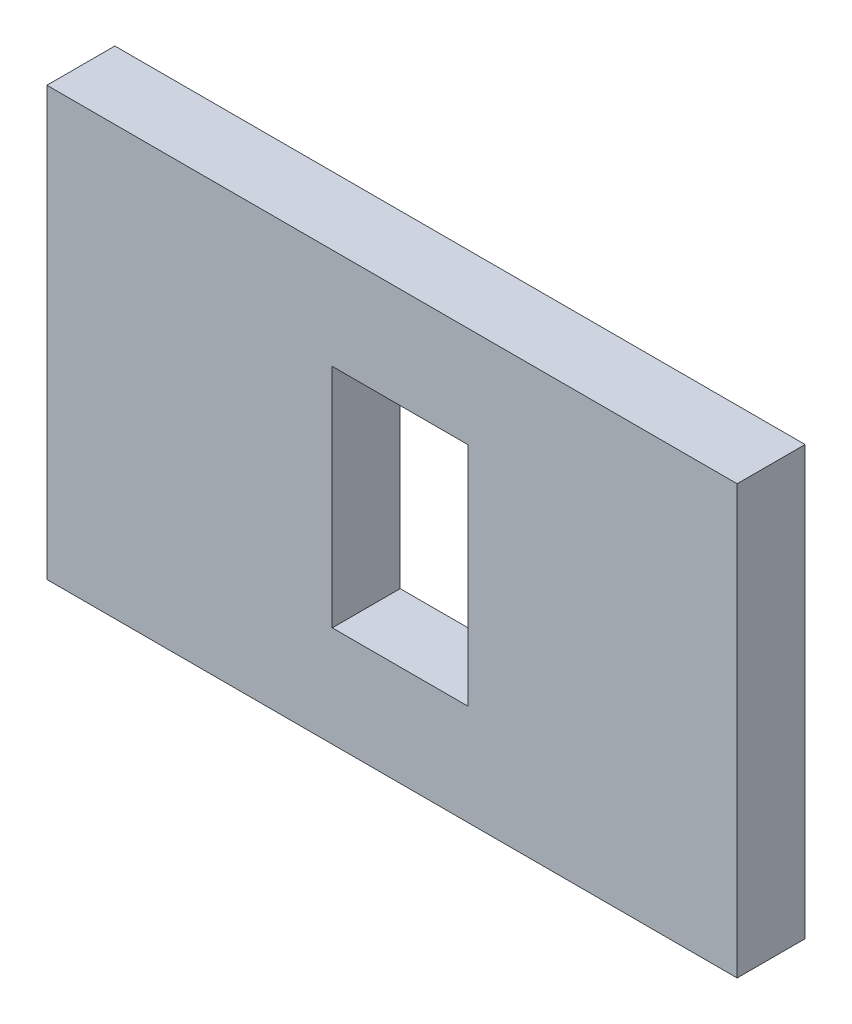
ISO-10303-21;
HEADER;
FILE_DESCRIPTION(('STEP AP214'),'2;1');
FILE_NAME('part.step','',(''),(''),'','','');
FILE_SCHEMA(('AUTOMOTIVE_DESIGN { 1 0 10303 214 1 1 1 1 }'));
ENDSEC;
DATA;
#1=APPLICATION_CONTEXT('core data for automotive mechanical design processes');
#2=APPLICATION_PROTOCOL_DEFINITION('international standard','automotive_design',2000,#1);
#3=PRODUCT_CONTEXT('',#1,'mechanical');
#4=PRODUCT('Part','Part','',(#3));
#5=PRODUCT_RELATED_PRODUCT_CATEGORY('part','',(#4));
#6=PRODUCT_DEFINITION_FORMATION('','',#4);
#7=PRODUCT_DEFINITION_CONTEXT('part definition',#1,'design');
#8=PRODUCT_DEFINITION('design','',#6,#7);
#9=PRODUCT_DEFINITION_SHAPE('','',#8);
#10=(LENGTH_UNIT() NAMED_UNIT(*) SI_UNIT(.MILLI.,.METRE.));
#11=(NAMED_UNIT(*) PLANE_ANGLE_UNIT() SI_UNIT($,.RADIAN.));
#12=(NAMED_UNIT(*) SI_UNIT($,.STERADIAN.) SOLID_ANGLE_UNIT());
#13=UNCERTAINTY_MEASURE_WITH_UNIT(LENGTH_MEASURE(1.E-05),#10,'distance_accuracy_value','');
#14=(GEOMETRIC_REPRESENTATION_CONTEXT(3) GLOBAL_UNCERTAINTY_ASSIGNED_CONTEXT((#13)) GLOBAL_UNIT_ASSIGNED_CONTEXT((#10,
#11,#12)) REPRESENTATION_CONTEXT('',''));
#15=CARTESIAN_POINT('',(0.,0.,0.));
#16=DIRECTION('',(0.,0.,1.));
#17=DIRECTION('',(1.,0.,0.));
#18=AXIS2_PLACEMENT_3D('',#15,#16,#17);
#19=CARTESIAN_POINT('',(0.,0.,6.));
#20=DIRECTION('',(0.,0.,1.));
#21=DIRECTION('',(1.,0.,0.));
#22=AXIS2_PLACEMENT_3D('',#19,#20,#21);
#23=PLANE('',#22);
#24=DIRECTION('',(0.,-1.,0.));
#25=VECTOR('',#24,1.);
#26=CARTESIAN_POINT('',(63.8023878554711,37.8,6.));
#27=LINE('',#26,#25);
#28=CARTESIAN_POINT('',(63.8023878554711,37.8,6.));
#29=VERTEX_POINT('',#28);
#30=CARTESIAN_POINT('',(63.8023878554711,0.,6.));
#31=VERTEX_POINT('',#30);
#32=EDGE_CURVE('E157',#29,#31,#27,.T.);
#33=ORIENTED_EDGE('',*,*,#32,.T.);
#34=DIRECTION('',(1.,0.,0.));
#35=VECTOR('',#34,1.);
#36=CARTESIAN_POINT('',(63.8023878554711,0.,6.));
#37=LINE('',#36,#35);
#38=CARTESIAN_POINT('',(124.755899643762,0.,6.));
#39=VERTEX_POINT('',#38);
#40=EDGE_CURVE('E161',#31,#39,#37,.T.);
#41=ORIENTED_EDGE('',*,*,#40,.T.);
#42=DIRECTION('',(0.,1.,0.));
#43=VECTOR('',#42,1.);
#44=CARTESIAN_POINT('',(124.755899643762,37.8,6.));
#45=LINE('',#44,#43);
#46=CARTESIAN_POINT('',(124.755899643762,37.8,6.));
#47=VERTEX_POINT('',#46);
#48=EDGE_CURVE('E165',#39,#47,#45,.T.);
#49=ORIENTED_EDGE('',*,*,#48,.T.);
#50=DIRECTION('',(-1.,0.,0.));
#51=VECTOR('',#50,1.);
#52=CARTESIAN_POINT('',(63.8023878554711,37.8,6.));
#53=LINE('',#52,#51);
#54=EDGE_CURVE('E168',#47,#29,#53,.T.);
#55=ORIENTED_EDGE('',*,*,#54,.T.);
#56=EDGE_LOOP('',(#33,#41,#49,#55));
#57=FACE_BOUND('',#56,.T.);
#58=DIRECTION('',(1.,0.,0.));
#59=VECTOR('',#58,1.);
#60=CARTESIAN_POINT('',(89.,8.9,6.));
#61=LINE('',#60,#59);
#62=CARTESIAN_POINT('',(89.,8.9,6.));
#63=VERTEX_POINT('',#62);
#64=CARTESIAN_POINT('',(101.,8.9,6.));
#65=VERTEX_POINT('',#64);
#66=EDGE_CURVE('E118',#63,#65,#61,.T.);
#67=ORIENTED_EDGE('',*,*,#66,.F.);
#68=DIRECTION('',(0.,-1.,0.));
#69=VECTOR('',#68,1.);
#70=CARTESIAN_POINT('',(89.,28.9,6.));
#71=LINE('',#70,#69);
#72=CARTESIAN_POINT('',(89.,28.9,6.));
#73=VERTEX_POINT('',#72);
#74=EDGE_CURVE('E109',#73,#63,#71,.T.);
#75=ORIENTED_EDGE('',*,*,#74,.F.);
#76=DIRECTION('',(-1.,0.,0.));
#77=VECTOR('',#76,1.);
#78=CARTESIAN_POINT('',(89.,28.9,6.));
#79=LINE('',#78,#77);
#80=CARTESIAN_POINT('',(101.,28.9,6.));
#81=VERTEX_POINT('',#80);
#82=EDGE_CURVE('E135',#81,#73,#79,.T.);
#83=ORIENTED_EDGE('',*,*,#82,.F.);
#84=DIRECTION('',(0.,1.,0.));
#85=VECTOR('',#84,1.);
#86=CARTESIAN_POINT('',(101.,28.9,6.));
#87=LINE('',#86,#85);
#88=EDGE_CURVE('E131',#65,#81,#87,.T.);
#89=ORIENTED_EDGE('',*,*,#88,.F.);
#90=EDGE_LOOP('',(#67,#75,#83,#89));
#91=FACE_BOUND('',#90,.T.);
#92=ADVANCED_FACE('F43',(#57,#91),#23,.T.);
#93=CARTESIAN_POINT('',(0.,0.,0.));
#94=DIRECTION('',(0.,0.,1.));
#95=DIRECTION('',(1.,0.,0.));
#96=AXIS2_PLACEMENT_3D('',#93,#94,#95);
#97=PLANE('',#96);
#98=DIRECTION('',(0.,-1.,0.));
#99=VECTOR('',#98,1.);
#100=CARTESIAN_POINT('',(63.8023878554711,37.8,0.));
#101=LINE('',#100,#99);
#102=CARTESIAN_POINT('',(63.8023878554711,37.8,0.));
#103=VERTEX_POINT('',#102);
#104=CARTESIAN_POINT('',(63.8023878554711,0.,0.));
#105=VERTEX_POINT('',#104);
#106=EDGE_CURVE('E127',#103,#105,#101,.T.);
#107=ORIENTED_EDGE('',*,*,#106,.F.);
#108=DIRECTION('',(-1.,0.,0.));
#109=VECTOR('',#108,1.);
#110=CARTESIAN_POINT('',(63.8023878554711,37.8,0.));
#111=LINE('',#110,#109);
#112=CARTESIAN_POINT('',(124.755899643762,37.8,0.));
#113=VERTEX_POINT('',#112);
#114=EDGE_CURVE('E162',#113,#103,#111,.T.);
#115=ORIENTED_EDGE('',*,*,#114,.F.);
#116=DIRECTION('',(0.,1.,0.));
#117=VECTOR('',#116,1.);
#118=CARTESIAN_POINT('',(124.755899643762,37.8,0.));
#119=LINE('',#118,#117);
#120=CARTESIAN_POINT('',(124.755899643762,0.,0.));
#121=VERTEX_POINT('',#120);
#122=EDGE_CURVE('E178',#121,#113,#119,.T.);
#123=ORIENTED_EDGE('',*,*,#122,.F.);
#124=DIRECTION('',(1.,0.,0.));
#125=VECTOR('',#124,1.);
#126=CARTESIAN_POINT('',(63.8023878554711,0.,0.));
#127=LINE('',#126,#125);
#128=EDGE_CURVE('E175',#105,#121,#127,.T.);
#129=ORIENTED_EDGE('',*,*,#128,.F.);
#130=EDGE_LOOP('',(#107,#115,#123,#129));
#131=FACE_BOUND('',#130,.T.);
#132=DIRECTION('',(0.,-1.,0.));
#133=VECTOR('',#132,1.);
#134=CARTESIAN_POINT('',(89.,28.9,0.));
#135=LINE('',#134,#133);
#136=CARTESIAN_POINT('',(89.,28.9,0.));
#137=VERTEX_POINT('',#136);
#138=CARTESIAN_POINT('',(89.,8.9,0.));
#139=VERTEX_POINT('',#138);
#140=EDGE_CURVE('E67',#137,#139,#135,.T.);
#141=ORIENTED_EDGE('',*,*,#140,.T.);
#142=DIRECTION('',(1.,0.,0.));
#143=VECTOR('',#142,1.);
#144=CARTESIAN_POINT('',(89.,8.9,0.));
#145=LINE('',#144,#143);
#146=CARTESIAN_POINT('',(101.,8.9,0.));
#147=VERTEX_POINT('',#146);
#148=EDGE_CURVE('E125',#139,#147,#145,.T.);
#149=ORIENTED_EDGE('',*,*,#148,.T.);
#150=DIRECTION('',(0.,1.,0.));
#151=VECTOR('',#150,1.);
#152=CARTESIAN_POINT('',(101.,28.9,0.));
#153=LINE('',#152,#151);
#154=CARTESIAN_POINT('',(101.,28.9,0.));
#155=VERTEX_POINT('',#154);
#156=EDGE_CURVE('E144',#147,#155,#153,.T.);
#157=ORIENTED_EDGE('',*,*,#156,.T.);
#158=DIRECTION('',(-1.,0.,0.));
#159=VECTOR('',#158,1.);
#160=CARTESIAN_POINT('',(89.,28.9,0.));
#161=LINE('',#160,#159);
#162=EDGE_CURVE('E119',#155,#137,#161,.T.);
#163=ORIENTED_EDGE('',*,*,#162,.T.);
#164=EDGE_LOOP('',(#141,#149,#157,#163));
#165=FACE_BOUND('',#164,.T.);
#166=ADVANCED_FACE('F201',(#131,#165),#97,.F.);
#167=CARTESIAN_POINT('',(63.8023878554711,37.8,6.));
#168=DIRECTION('',(1.,0.,0.));
#169=DIRECTION('',(0.,0.,-1.));
#170=AXIS2_PLACEMENT_3D('',#167,#168,#169);
#171=PLANE('',#170);
#172=ORIENTED_EDGE('',*,*,#106,.T.);
#173=DIRECTION('',(0.,0.,-1.));
#174=VECTOR('',#173,1.);
#175=CARTESIAN_POINT('',(63.8023878554711,0.,6.));
#176=LINE('',#175,#174);
#177=EDGE_CURVE('E11',#31,#105,#176,.T.);
#178=ORIENTED_EDGE('',*,*,#177,.F.);
#179=ORIENTED_EDGE('',*,*,#32,.F.);
#180=DIRECTION('',(0.,0.,-1.));
#181=VECTOR('',#180,1.);
#182=CARTESIAN_POINT('',(63.8023878554711,37.8,6.));
#183=LINE('',#182,#181);
#184=EDGE_CURVE('E171',#29,#103,#183,.T.);
#185=ORIENTED_EDGE('',*,*,#184,.T.);
#186=EDGE_LOOP('',(#172,#178,#179,#185));
#187=FACE_BOUND('',#186,.T.);
#188=ADVANCED_FACE('F45',(#187),#171,.F.);
#189=CARTESIAN_POINT('',(63.8023878554711,0.,6.));
#190=DIRECTION('',(0.,1.,0.));
#191=DIRECTION('',(0.,0.,1.));
#192=AXIS2_PLACEMENT_3D('',#189,#190,#191);
#193=PLANE('',#192);
#194=ORIENTED_EDGE('',*,*,#128,.T.);
#195=DIRECTION('',(0.,0.,-1.));
#196=VECTOR('',#195,1.);
#197=CARTESIAN_POINT('',(124.755899643762,0.,6.));
#198=LINE('',#197,#196);
#199=EDGE_CURVE('E52',#39,#121,#198,.T.);
#200=ORIENTED_EDGE('',*,*,#199,.F.);
#201=ORIENTED_EDGE('',*,*,#40,.F.);
#202=ORIENTED_EDGE('',*,*,#177,.T.);
#203=EDGE_LOOP('',(#194,#200,#201,#202));
#204=FACE_BOUND('',#203,.T.);
#205=ADVANCED_FACE('F211',(#204),#193,.F.);
#206=CARTESIAN_POINT('',(124.755899643762,37.8,6.));
#207=DIRECTION('',(-1.,0.,0.));
#208=DIRECTION('',(0.,0.,1.));
#209=AXIS2_PLACEMENT_3D('',#206,#207,#208);
#210=PLANE('',#209);
#211=ORIENTED_EDGE('',*,*,#122,.T.);
#212=DIRECTION('',(0.,0.,-1.));
#213=VECTOR('',#212,1.);
#214=CARTESIAN_POINT('',(124.755899643762,37.8,6.));
#215=LINE('',#214,#213);
#216=EDGE_CURVE('E186',#47,#113,#215,.T.);
#217=ORIENTED_EDGE('',*,*,#216,.F.);
#218=ORIENTED_EDGE('',*,*,#48,.F.);
#219=ORIENTED_EDGE('',*,*,#199,.T.);
#220=EDGE_LOOP('',(#211,#217,#218,#219));
#221=FACE_BOUND('',#220,.T.);
#222=ADVANCED_FACE('F195',(#221),#210,.F.);
#223=CARTESIAN_POINT('',(63.8023878554711,37.8,6.));
#224=DIRECTION('',(0.,-1.,0.));
#225=DIRECTION('',(0.,0.,-1.));
#226=AXIS2_PLACEMENT_3D('',#223,#224,#225);
#227=PLANE('',#226);
#228=ORIENTED_EDGE('',*,*,#114,.T.);
#229=ORIENTED_EDGE('',*,*,#184,.F.);
#230=ORIENTED_EDGE('',*,*,#54,.F.);
#231=ORIENTED_EDGE('',*,*,#216,.T.);
#232=EDGE_LOOP('',(#228,#229,#230,#231));
#233=FACE_BOUND('',#232,.T.);
#234=ADVANCED_FACE('F205',(#233),#227,.F.);
#235=CARTESIAN_POINT('',(89.,28.9,6.));
#236=DIRECTION('',(1.,0.,0.));
#237=DIRECTION('',(0.,0.,-1.));
#238=AXIS2_PLACEMENT_3D('',#235,#236,#237);
#239=PLANE('',#238);
#240=ORIENTED_EDGE('',*,*,#140,.F.);
#241=DIRECTION('',(0.,0.,-1.));
#242=VECTOR('',#241,1.);
#243=CARTESIAN_POINT('',(89.,28.9,6.));
#244=LINE('',#243,#242);
#245=EDGE_CURVE('E113',#73,#137,#244,.T.);
#246=ORIENTED_EDGE('',*,*,#245,.F.);
#247=ORIENTED_EDGE('',*,*,#74,.T.);
#248=DIRECTION('',(0.,0.,-1.));
#249=VECTOR('',#248,1.);
#250=CARTESIAN_POINT('',(89.,8.9,6.));
#251=LINE('',#250,#249);
#252=EDGE_CURVE('E112',#63,#139,#251,.T.);
#253=ORIENTED_EDGE('',*,*,#252,.T.);
#254=EDGE_LOOP('',(#240,#246,#247,#253));
#255=FACE_BOUND('',#254,.T.);
#256=ADVANCED_FACE('F111',(#255),#239,.T.);
#257=CARTESIAN_POINT('',(89.,8.9,6.));
#258=DIRECTION('',(0.,1.,0.));
#259=DIRECTION('',(0.,0.,1.));
#260=AXIS2_PLACEMENT_3D('',#257,#258,#259);
#261=PLANE('',#260);
#262=ORIENTED_EDGE('',*,*,#148,.F.);
#263=ORIENTED_EDGE('',*,*,#252,.F.);
#264=ORIENTED_EDGE('',*,*,#66,.T.);
#265=DIRECTION('',(0.,0.,-1.));
#266=VECTOR('',#265,1.);
#267=CARTESIAN_POINT('',(101.,8.9,6.));
#268=LINE('',#267,#266);
#269=EDGE_CURVE('E128',#65,#147,#268,.T.);
#270=ORIENTED_EDGE('',*,*,#269,.T.);
#271=EDGE_LOOP('',(#262,#263,#264,#270));
#272=FACE_BOUND('',#271,.T.);
#273=ADVANCED_FACE('F122',(#272),#261,.T.);
#274=CARTESIAN_POINT('',(101.,28.9,6.));
#275=DIRECTION('',(-1.,0.,0.));
#276=DIRECTION('',(0.,0.,1.));
#277=AXIS2_PLACEMENT_3D('',#274,#275,#276);
#278=PLANE('',#277);
#279=ORIENTED_EDGE('',*,*,#156,.F.);
#280=ORIENTED_EDGE('',*,*,#269,.F.);
#281=ORIENTED_EDGE('',*,*,#88,.T.);
#282=DIRECTION('',(0.,0.,-1.));
#283=VECTOR('',#282,1.);
#284=CARTESIAN_POINT('',(101.,28.9,6.));
#285=LINE('',#284,#283);
#286=EDGE_CURVE('E59',#81,#155,#285,.T.);
#287=ORIENTED_EDGE('',*,*,#286,.T.);
#288=EDGE_LOOP('',(#279,#280,#281,#287));
#289=FACE_BOUND('',#288,.T.);
#290=ADVANCED_FACE('F234',(#289),#278,.T.);
#291=CARTESIAN_POINT('',(89.,28.9,6.));
#292=DIRECTION('',(0.,-1.,0.));
#293=DIRECTION('',(0.,0.,-1.));
#294=AXIS2_PLACEMENT_3D('',#291,#292,#293);
#295=PLANE('',#294);
#296=ORIENTED_EDGE('',*,*,#162,.F.);
#297=ORIENTED_EDGE('',*,*,#286,.F.);
#298=ORIENTED_EDGE('',*,*,#82,.T.);
#299=ORIENTED_EDGE('',*,*,#245,.T.);
#300=EDGE_LOOP('',(#296,#297,#298,#299));
#301=FACE_BOUND('',#300,.T.);
#302=ADVANCED_FACE('F238',(#301),#295,.T.);
#303=CLOSED_SHELL('',(#92,#166,#188,#205,#222,#234,#256,#273,#290,#302));
#304=MANIFOLD_SOLID_BREP('B2',#303);
#305=ADVANCED_BREP_SHAPE_REPRESENTATION('',(#18,#304),#14);
#306=SHAPE_DEFINITION_REPRESENTATION(#9,#305);
ENDSEC;
END-ISO-10303-21;
